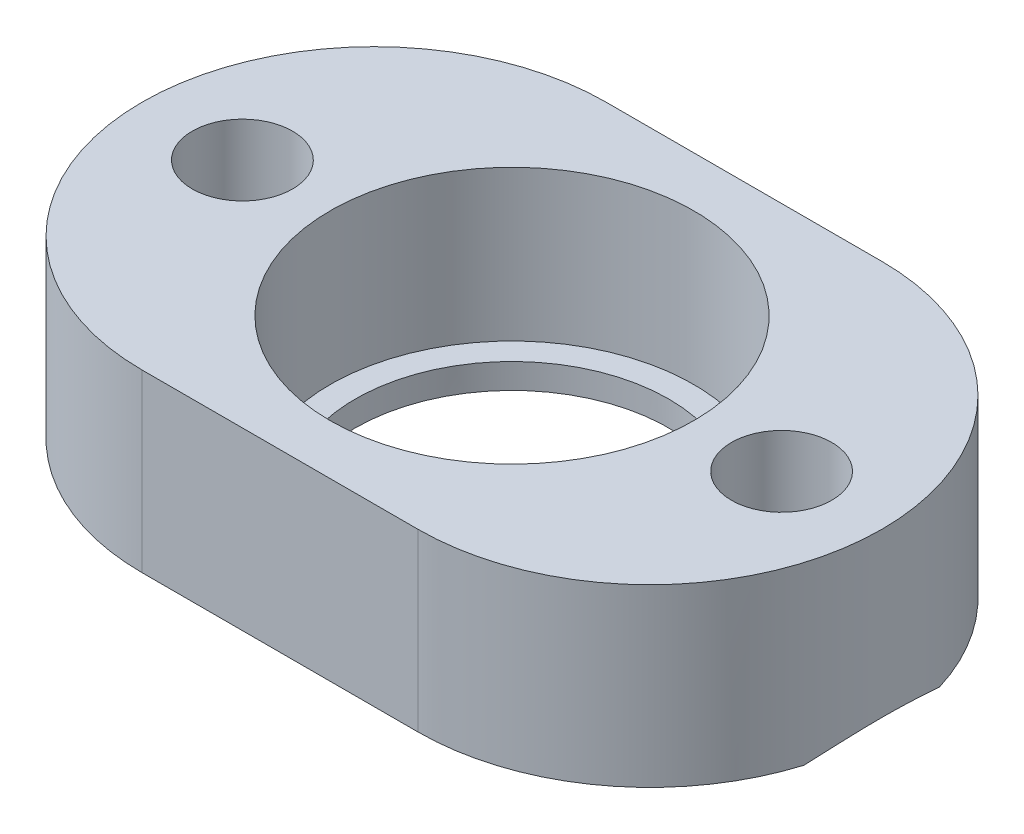
ISO-10303-21;
HEADER;
FILE_DESCRIPTION(('STEP AP214'),'2;1');
FILE_NAME('part.step','',(''),(''),'','','');
FILE_SCHEMA(('AUTOMOTIVE_DESIGN { 1 0 10303 214 1 1 1 1 }'));
ENDSEC;
DATA;
#1=APPLICATION_CONTEXT('core data for automotive mechanical design processes');
#2=APPLICATION_PROTOCOL_DEFINITION('international standard','automotive_design',2000,#1);
#3=PRODUCT_CONTEXT('',#1,'mechanical');
#4=PRODUCT('Part','Part','',(#3));
#5=PRODUCT_RELATED_PRODUCT_CATEGORY('part','',(#4));
#6=PRODUCT_DEFINITION_FORMATION('','',#4);
#7=PRODUCT_DEFINITION_CONTEXT('part definition',#1,'design');
#8=PRODUCT_DEFINITION('design','',#6,#7);
#9=PRODUCT_DEFINITION_SHAPE('','',#8);
#10=(LENGTH_UNIT() NAMED_UNIT(*) SI_UNIT(.MILLI.,.METRE.));
#11=(NAMED_UNIT(*) PLANE_ANGLE_UNIT() SI_UNIT($,.RADIAN.));
#12=(NAMED_UNIT(*) SI_UNIT($,.STERADIAN.) SOLID_ANGLE_UNIT());
#13=UNCERTAINTY_MEASURE_WITH_UNIT(LENGTH_MEASURE(1.E-05),#10,'distance_accuracy_value','');
#14=(GEOMETRIC_REPRESENTATION_CONTEXT(3) GLOBAL_UNCERTAINTY_ASSIGNED_CONTEXT((#13)) GLOBAL_UNIT_ASSIGNED_CONTEXT((#10,
#11,#12)) REPRESENTATION_CONTEXT('',''));
#15=CARTESIAN_POINT('',(0.,0.,0.));
#16=DIRECTION('',(0.,0.,1.));
#17=DIRECTION('',(1.,0.,0.));
#18=AXIS2_PLACEMENT_3D('',#15,#16,#17);
#19=CARTESIAN_POINT('',(0.,-1.,0.));
#20=DIRECTION('',(0.,1.,0.));
#21=DIRECTION('',(0.,0.,1.));
#22=AXIS2_PLACEMENT_3D('',#19,#20,#21);
#23=PLANE('',#22);
#24=CARTESIAN_POINT('',(5.5,-1.,0.));
#25=DIRECTION('',(0.,1.,0.));
#26=DIRECTION('',(0.,0.,1.));
#27=AXIS2_PLACEMENT_3D('',#24,#25,#26);
#28=CIRCLE('',#27,9.25);
#29=CARTESIAN_POINT('',(14.3452380952381,-1.,-2.70633756921577));
#30=VERTEX_POINT('',#29);
#31=CARTESIAN_POINT('',(5.5,-1.,-9.25));
#32=VERTEX_POINT('',#31);
#33=EDGE_CURVE('E125',#30,#32,#28,.T.);
#34=ORIENTED_EDGE('',*,*,#33,.F.);
#35=CARTESIAN_POINT('',(10.75,-1.,0.));
#36=DIRECTION('',(0.,1.,0.));
#37=DIRECTION('',(0.,0.,1.));
#38=AXIS2_PLACEMENT_3D('',#35,#36,#37);
#39=CIRCLE('',#38,4.5);
#40=CARTESIAN_POINT('',(6.25,-1.,0.));
#41=VERTEX_POINT('',#40);
#42=EDGE_CURVE('E195',#30,#41,#39,.T.);
#43=ORIENTED_EDGE('',*,*,#42,.T.);
#44=CARTESIAN_POINT('',(0.,-1.,0.));
#45=DIRECTION('',(0.,1.,0.));
#46=DIRECTION('',(0.,0.,1.));
#47=AXIS2_PLACEMENT_3D('',#44,#45,#46);
#48=CIRCLE('',#47,6.25);
#49=CARTESIAN_POINT('',(-6.25,-1.,0.));
#50=VERTEX_POINT('',#49);
#51=EDGE_CURVE('E148',#41,#50,#48,.T.);
#52=ORIENTED_EDGE('',*,*,#51,.T.);
#53=CARTESIAN_POINT('',(-10.75,-1.,0.));
#54=DIRECTION('',(0.,1.,0.));
#55=DIRECTION('',(0.,0.,1.));
#56=AXIS2_PLACEMENT_3D('',#53,#54,#55);
#57=CIRCLE('',#56,4.5);
#58=CARTESIAN_POINT('',(-14.3452380952381,-1.,-2.70633756921577));
#59=VERTEX_POINT('',#58);
#60=EDGE_CURVE('E58',#50,#59,#57,.T.);
#61=ORIENTED_EDGE('',*,*,#60,.T.);
#62=CARTESIAN_POINT('',(-5.5,-1.,0.));
#63=DIRECTION('',(0.,1.,0.));
#64=DIRECTION('',(0.,0.,1.));
#65=AXIS2_PLACEMENT_3D('',#62,#63,#64);
#66=CIRCLE('',#65,9.25);
#67=CARTESIAN_POINT('',(-5.5,-1.,-9.25));
#68=VERTEX_POINT('',#67);
#69=EDGE_CURVE('E143',#68,#59,#66,.T.);
#70=ORIENTED_EDGE('',*,*,#69,.F.);
#71=DIRECTION('',(1.,0.,0.));
#72=VECTOR('',#71,1.);
#73=CARTESIAN_POINT('',(0.,-1.,-9.25));
#74=LINE('',#73,#72);
#75=EDGE_CURVE('E124',#68,#32,#74,.T.);
#76=ORIENTED_EDGE('',*,*,#75,.T.);
#77=EDGE_LOOP('',(#34,#43,#52,#61,#70,#76));
#78=FACE_BOUND('',#77,.T.);
#79=ADVANCED_FACE('F41',(#78),#23,.F.);
#80=CARTESIAN_POINT('',(0.,6.,9.25));
#81=DIRECTION('',(0.,0.,-1.));
#82=DIRECTION('',(-1.,0.,0.));
#83=AXIS2_PLACEMENT_3D('',#80,#81,#82);
#84=PLANE('',#83);
#85=DIRECTION('',(0.,-1.,0.));
#86=VECTOR('',#85,1.);
#87=CARTESIAN_POINT('',(-5.5,6.,9.25));
#88=LINE('',#87,#86);
#89=CARTESIAN_POINT('',(-5.5,6.,9.25));
#90=VERTEX_POINT('',#89);
#91=CARTESIAN_POINT('',(-5.5,-1.,9.25));
#92=VERTEX_POINT('',#91);
#93=EDGE_CURVE('E130',#90,#92,#88,.T.);
#94=ORIENTED_EDGE('',*,*,#93,.T.);
#95=DIRECTION('',(1.,0.,0.));
#96=VECTOR('',#95,1.);
#97=CARTESIAN_POINT('',(0.,-1.,9.25));
#98=LINE('',#97,#96);
#99=CARTESIAN_POINT('',(5.5,-1.,9.25));
#100=VERTEX_POINT('',#99);
#101=EDGE_CURVE('E122',#92,#100,#98,.T.);
#102=ORIENTED_EDGE('',*,*,#101,.T.);
#103=DIRECTION('',(0.,-1.,0.));
#104=VECTOR('',#103,1.);
#105=CARTESIAN_POINT('',(5.5,6.,9.25));
#106=LINE('',#105,#104);
#107=CARTESIAN_POINT('',(5.5,6.,9.25));
#108=VERTEX_POINT('',#107);
#109=EDGE_CURVE('E104',#108,#100,#106,.T.);
#110=ORIENTED_EDGE('',*,*,#109,.F.);
#111=DIRECTION('',(1.,0.,0.));
#112=VECTOR('',#111,1.);
#113=CARTESIAN_POINT('',(0.,6.,9.25));
#114=LINE('',#113,#112);
#115=EDGE_CURVE('E165',#90,#108,#114,.T.);
#116=ORIENTED_EDGE('',*,*,#115,.F.);
#117=EDGE_LOOP('',(#94,#102,#110,#116));
#118=FACE_BOUND('',#117,.T.);
#119=ADVANCED_FACE('F128',(#118),#84,.F.);
#120=CARTESIAN_POINT('',(5.5,6.,0.));
#121=DIRECTION('',(0.,-1.,0.));
#122=DIRECTION('',(0.,0.,-1.));
#123=AXIS2_PLACEMENT_3D('',#120,#121,#122);
#124=CYLINDRICAL_SURFACE('',#123,9.25);
#125=CARTESIAN_POINT('',(14.3452380952381,-1.,2.70633756921577));
#126=VERTEX_POINT('',#125);
#127=EDGE_CURVE('E107',#100,#126,#28,.T.);
#128=ORIENTED_EDGE('',*,*,#127,.T.);
#129=CARTESIAN_POINT('',(14.3452380952381,-1.,2.70633756921577));
#130=CARTESIAN_POINT('',(14.4005407688638,-0.935493695261102,2.52564014494542));
#131=CARTESIAN_POINT('',(14.4507745591444,-0.875482764336143,2.34161394553068));
#132=CARTESIAN_POINT('',(14.5404234067328,-0.766556499262465,1.96730652761882));
#133=CARTESIAN_POINT('',(14.5798149102748,-0.717665361102824,1.7770126811542));
#134=CARTESIAN_POINT('',(14.6466442212189,-0.633643403359603,1.39255970363823));
#135=CARTESIAN_POINT('',(14.6741549685721,-0.598428757669724,1.19843203770935));
#136=CARTESIAN_POINT('',(14.7168490347795,-0.543371774768669,0.806804065461048));
#137=CARTESIAN_POINT('',(14.7320433796191,-0.523515688878993,0.609306937693022));
#138=CARTESIAN_POINT('',(14.7490684829981,-0.501236745924466,0.226572270761467));
#139=CARTESIAN_POINT('',(14.7517555904864,-0.497696921483751,0.0414379650190529));
#140=CARTESIAN_POINT('',(14.7460185790206,-0.505223947814993,-0.328406211838497));
#141=CARTESIAN_POINT('',(14.7375916413979,-0.516294503972902,-0.513115963378348));
#142=CARTESIAN_POINT('',(14.7098638614297,-0.552375426620868,-0.880220129047334));
#143=CARTESIAN_POINT('',(14.6905684649902,-0.577378811660519,-1.06261565600821));
#144=CARTESIAN_POINT('',(14.6415905753966,-0.639960183183422,-1.42373607203203));
#145=CARTESIAN_POINT('',(14.6119108165069,-0.677534859457195,-1.60246191424279));
#146=CARTESIAN_POINT('',(14.5462218507953,-0.759243839245206,-1.93767050983732));
#147=CARTESIAN_POINT('',(14.511140516177,-0.802348579223171,-2.09459236902607));
#148=CARTESIAN_POINT('',(14.4336047983298,-0.895947133983661,-2.40386466733927));
#149=CARTESIAN_POINT('',(14.3911712527582,-0.946420003990821,-2.55622663619054));
#150=CARTESIAN_POINT('',(14.3452380952381,-1.,-2.70633756921577));
#151=B_SPLINE_CURVE_WITH_KNOTS('',3,(#129,#130,#131,#132,#133,#134,#135,#136,#137,#138,#139,
#140,#141,#142,#143,#144,#145,#146,#147,#148,#149,#150),.UNSPECIFIED.,.F.,.F.,(4,2,2,2,2,2,2,2,
2,2,4),(0.,0.599126952346497,1.19954535495381,1.79622329114623,2.39236647291312,
2.94702618814857,3.5018265994667,4.05634926151056,4.61072602418988,5.10974967093786,
5.60738145213413),.UNSPECIFIED.);
#152=EDGE_CURVE('E198',#126,#30,#151,.T.);
#153=ORIENTED_EDGE('',*,*,#152,.T.);
#154=ORIENTED_EDGE('',*,*,#33,.T.);
#155=DIRECTION('',(0.,-1.,0.));
#156=VECTOR('',#155,1.);
#157=CARTESIAN_POINT('',(5.5,6.,-9.25));
#158=LINE('',#157,#156);
#159=CARTESIAN_POINT('',(5.5,6.,-9.25));
#160=VERTEX_POINT('',#159);
#161=EDGE_CURVE('E115',#160,#32,#158,.T.);
#162=ORIENTED_EDGE('',*,*,#161,.F.);
#163=CARTESIAN_POINT('',(5.5,6.,0.));
#164=DIRECTION('',(0.,1.,0.));
#165=DIRECTION('',(0.,0.,1.));
#166=AXIS2_PLACEMENT_3D('',#163,#164,#165);
#167=CIRCLE('',#166,9.25);
#168=EDGE_CURVE('E109',#108,#160,#167,.T.);
#169=ORIENTED_EDGE('',*,*,#168,.F.);
#170=ORIENTED_EDGE('',*,*,#109,.T.);
#171=EDGE_LOOP('',(#128,#153,#154,#162,#169,#170));
#172=FACE_BOUND('',#171,.T.);
#173=ADVANCED_FACE('F106',(#172),#124,.T.);
#174=CARTESIAN_POINT('',(0.,6.,-9.25));
#175=DIRECTION('',(0.,0.,-1.));
#176=DIRECTION('',(-1.,0.,0.));
#177=AXIS2_PLACEMENT_3D('',#174,#175,#176);
#178=PLANE('',#177);
#179=ORIENTED_EDGE('',*,*,#161,.T.);
#180=ORIENTED_EDGE('',*,*,#75,.F.);
#181=DIRECTION('',(0.,-1.,0.));
#182=VECTOR('',#181,1.);
#183=CARTESIAN_POINT('',(-5.5,6.,-9.25));
#184=LINE('',#183,#182);
#185=CARTESIAN_POINT('',(-5.5,6.,-9.25));
#186=VERTEX_POINT('',#185);
#187=EDGE_CURVE('E182',#186,#68,#184,.T.);
#188=ORIENTED_EDGE('',*,*,#187,.F.);
#189=DIRECTION('',(1.,0.,0.));
#190=VECTOR('',#189,1.);
#191=CARTESIAN_POINT('',(0.,6.,-9.25));
#192=LINE('',#191,#190);
#193=EDGE_CURVE('E170',#186,#160,#192,.T.);
#194=ORIENTED_EDGE('',*,*,#193,.T.);
#195=EDGE_LOOP('',(#179,#180,#188,#194));
#196=FACE_BOUND('',#195,.T.);
#197=ADVANCED_FACE('F214',(#196),#178,.T.);
#198=CARTESIAN_POINT('',(-10.75,6.,0.));
#199=DIRECTION('',(0.,-1.,0.));
#200=DIRECTION('',(0.,0.,-1.));
#201=AXIS2_PLACEMENT_3D('',#198,#199,#200);
#202=CYLINDRICAL_SURFACE('',#201,2.);
#203=CARTESIAN_POINT('',(-10.75,1.50000000000001,0.));
#204=DIRECTION('',(0.,1.,0.));
#205=DIRECTION('',(0.,0.,1.));
#206=AXIS2_PLACEMENT_3D('',#203,#204,#205);
#207=CIRCLE('',#206,2.);
#208=CARTESIAN_POINT('',(-10.75,1.50000000000001,2.));
#209=VERTEX_POINT('',#208);
#210=EDGE_CURVE('E11',#209,#209,#207,.F.);
#211=ORIENTED_EDGE('',*,*,#210,.T.);
#212=EDGE_LOOP('',(#211));
#213=FACE_BOUND('',#212,.T.);
#214=CARTESIAN_POINT('',(-10.75,6.,0.));
#215=DIRECTION('',(0.,1.,0.));
#216=DIRECTION('',(0.,0.,1.));
#217=AXIS2_PLACEMENT_3D('',#214,#215,#216);
#218=CIRCLE('',#217,2.);
#219=CARTESIAN_POINT('',(-10.75,6.,2.));
#220=VERTEX_POINT('',#219);
#221=EDGE_CURVE('E161',#220,#220,#218,.T.);
#222=ORIENTED_EDGE('',*,*,#221,.T.);
#223=EDGE_LOOP('',(#222));
#224=FACE_BOUND('',#223,.T.);
#225=ADVANCED_FACE('F218',(#213,#224),#202,.F.);
#226=CARTESIAN_POINT('',(0.,6.,0.));
#227=DIRECTION('',(0.,-1.,0.));
#228=DIRECTION('',(0.,0.,-1.));
#229=AXIS2_PLACEMENT_3D('',#226,#227,#228);
#230=CYLINDRICAL_SURFACE('',#229,7.25);
#231=CARTESIAN_POINT('',(0.,6.,0.));
#232=DIRECTION('',(0.,1.,0.));
#233=DIRECTION('',(0.,0.,1.));
#234=AXIS2_PLACEMENT_3D('',#231,#232,#233);
#235=CIRCLE('',#234,7.25);
#236=CARTESIAN_POINT('',(0.,6.,7.25));
#237=VERTEX_POINT('',#236);
#238=EDGE_CURVE('E157',#237,#237,#235,.T.);
#239=ORIENTED_EDGE('',*,*,#238,.T.);
#240=EDGE_LOOP('',(#239));
#241=FACE_BOUND('',#240,.T.);
#242=CARTESIAN_POINT('',(0.,0.,0.));
#243=DIRECTION('',(0.,1.,0.));
#244=DIRECTION('',(0.,0.,1.));
#245=AXIS2_PLACEMENT_3D('',#242,#243,#244);
#246=CIRCLE('',#245,7.25);
#247=CARTESIAN_POINT('',(0.,0.,7.25));
#248=VERTEX_POINT('',#247);
#249=EDGE_CURVE('E151',#248,#248,#246,.T.);
#250=ORIENTED_EDGE('',*,*,#249,.F.);
#251=EDGE_LOOP('',(#250));
#252=FACE_BOUND('',#251,.T.);
#253=ADVANCED_FACE('F221',(#241,#252),#230,.F.);
#254=CARTESIAN_POINT('',(10.75,6.,0.));
#255=DIRECTION('',(0.,-1.,0.));
#256=DIRECTION('',(0.,0.,-1.));
#257=AXIS2_PLACEMENT_3D('',#254,#255,#256);
#258=CYLINDRICAL_SURFACE('',#257,2.);
#259=CARTESIAN_POINT('',(10.75,1.50000000000001,0.));
#260=DIRECTION('',(0.,1.,0.));
#261=DIRECTION('',(0.,0.,1.));
#262=AXIS2_PLACEMENT_3D('',#259,#260,#261);
#263=CIRCLE('',#262,2.);
#264=CARTESIAN_POINT('',(10.75,1.50000000000001,2.));
#265=VERTEX_POINT('',#264);
#266=EDGE_CURVE('E206',#265,#265,#263,.F.);
#267=ORIENTED_EDGE('',*,*,#266,.T.);
#268=EDGE_LOOP('',(#267));
#269=FACE_BOUND('',#268,.T.);
#270=CARTESIAN_POINT('',(10.75,6.,0.));
#271=DIRECTION('',(0.,1.,0.));
#272=DIRECTION('',(0.,0.,1.));
#273=AXIS2_PLACEMENT_3D('',#270,#271,#272);
#274=CIRCLE('',#273,2.);
#275=CARTESIAN_POINT('',(10.75,6.,2.));
#276=VERTEX_POINT('',#275);
#277=EDGE_CURVE('E153',#276,#276,#274,.T.);
#278=ORIENTED_EDGE('',*,*,#277,.T.);
#279=EDGE_LOOP('',(#278));
#280=FACE_BOUND('',#279,.T.);
#281=ADVANCED_FACE('F224',(#269,#280),#258,.F.);
#282=CARTESIAN_POINT('',(-5.5,6.,0.));
#283=DIRECTION('',(0.,-1.,0.));
#284=DIRECTION('',(0.,0.,-1.));
#285=AXIS2_PLACEMENT_3D('',#282,#283,#284);
#286=CYLINDRICAL_SURFACE('',#285,9.25);
#287=ORIENTED_EDGE('',*,*,#69,.T.);
#288=CARTESIAN_POINT('',(-14.3452380952381,-1.,-2.70633756921577));
#289=CARTESIAN_POINT('',(-14.4005407688638,-0.935493695261102,-2.52564014494542));
#290=CARTESIAN_POINT('',(-14.4507745591444,-0.875482764336143,-2.34161394553068));
#291=CARTESIAN_POINT('',(-14.5404234067328,-0.766556499262465,-1.96730652761882));
#292=CARTESIAN_POINT('',(-14.5798149102748,-0.717665361102824,-1.7770126811542));
#293=CARTESIAN_POINT('',(-14.6466442212189,-0.633643403359603,-1.39255970363823));
#294=CARTESIAN_POINT('',(-14.6741549685721,-0.598428757669724,-1.19843203770935));
#295=CARTESIAN_POINT('',(-14.7168490347795,-0.543371774768669,-0.806804065461048));
#296=CARTESIAN_POINT('',(-14.7320433796191,-0.523515688878993,-0.609306937693022));
#297=CARTESIAN_POINT('',(-14.7490684829981,-0.501236745924466,-0.226572270761467));
#298=CARTESIAN_POINT('',(-14.7517555904864,-0.497696921483751,-0.0414379650190529));
#299=CARTESIAN_POINT('',(-14.7460185790206,-0.505223947814993,0.328406211838497));
#300=CARTESIAN_POINT('',(-14.7375916413979,-0.516294503972902,0.513115963378348));
#301=CARTESIAN_POINT('',(-14.7098638614297,-0.552375426620868,0.880220129047334));
#302=CARTESIAN_POINT('',(-14.6905684649902,-0.577378811660519,1.06261565600821));
#303=CARTESIAN_POINT('',(-14.6415905753966,-0.639960183183422,1.42373607203203));
#304=CARTESIAN_POINT('',(-14.6119108165069,-0.677534859457195,1.60246191424279));
#305=CARTESIAN_POINT('',(-14.5462218507953,-0.759243839245206,1.93767050983732));
#306=CARTESIAN_POINT('',(-14.511140516177,-0.802348579223171,2.09459236902607));
#307=CARTESIAN_POINT('',(-14.4336047983298,-0.895947133983661,2.40386466733927));
#308=CARTESIAN_POINT('',(-14.3911712527582,-0.946420003990821,2.55622663619054));
#309=CARTESIAN_POINT('',(-14.3452380952381,-1.,2.70633756921577));
#310=B_SPLINE_CURVE_WITH_KNOTS('',3,(#288,#289,#290,#291,#292,#293,#294,#295,#296,#297,#298,
#299,#300,#301,#302,#303,#304,#305,#306,#307,#308,#309),.UNSPECIFIED.,.F.,.F.,(4,2,2,2,2,2,2,2,
2,2,4),(0.,0.599126952346497,1.19954535495381,1.79622329114623,2.39236647291312,
2.94702618814857,3.5018265994667,4.05634926151056,4.61072602418988,5.10974967093786,
5.60738145213413),.UNSPECIFIED.);
#311=CARTESIAN_POINT('',(-14.3452380952381,-1.,2.70633756921577));
#312=VERTEX_POINT('',#311);
#313=EDGE_CURVE('E51',#59,#312,#310,.T.);
#314=ORIENTED_EDGE('',*,*,#313,.T.);
#315=EDGE_CURVE('E142',#312,#92,#66,.T.);
#316=ORIENTED_EDGE('',*,*,#315,.T.);
#317=ORIENTED_EDGE('',*,*,#93,.F.);
#318=CARTESIAN_POINT('',(-5.5,6.,0.));
#319=DIRECTION('',(0.,1.,0.));
#320=DIRECTION('',(0.,0.,1.));
#321=AXIS2_PLACEMENT_3D('',#318,#319,#320);
#322=CIRCLE('',#321,9.25);
#323=EDGE_CURVE('E174',#186,#90,#322,.T.);
#324=ORIENTED_EDGE('',*,*,#323,.F.);
#325=ORIENTED_EDGE('',*,*,#187,.T.);
#326=EDGE_LOOP('',(#287,#314,#316,#317,#324,#325));
#327=FACE_BOUND('',#326,.T.);
#328=ADVANCED_FACE('F227',(#327),#286,.T.);
#329=CARTESIAN_POINT('',(0.,6.,0.));
#330=DIRECTION('',(0.,1.,0.));
#331=DIRECTION('',(0.,0.,1.));
#332=AXIS2_PLACEMENT_3D('',#329,#330,#331);
#333=PLANE('',#332);
#334=ORIENTED_EDGE('',*,*,#277,.F.);
#335=EDGE_LOOP('',(#334));
#336=FACE_BOUND('',#335,.T.);
#337=ORIENTED_EDGE('',*,*,#238,.F.);
#338=EDGE_LOOP('',(#337));
#339=FACE_BOUND('',#338,.T.);
#340=ORIENTED_EDGE('',*,*,#221,.F.);
#341=EDGE_LOOP('',(#340));
#342=FACE_BOUND('',#341,.T.);
#343=ORIENTED_EDGE('',*,*,#115,.T.);
#344=ORIENTED_EDGE('',*,*,#168,.T.);
#345=ORIENTED_EDGE('',*,*,#193,.F.);
#346=ORIENTED_EDGE('',*,*,#323,.T.);
#347=EDGE_LOOP('',(#343,#344,#345,#346));
#348=FACE_BOUND('',#347,.T.);
#349=ADVANCED_FACE('F232',(#336,#339,#342,#348),#333,.T.);
#350=CARTESIAN_POINT('',(0.,0.,0.));
#351=DIRECTION('',(0.,1.,0.));
#352=DIRECTION('',(0.,0.,1.));
#353=AXIS2_PLACEMENT_3D('',#350,#351,#352);
#354=PLANE('',#353);
#355=CARTESIAN_POINT('',(0.,0.,0.));
#356=DIRECTION('',(0.,1.,0.));
#357=DIRECTION('',(0.,0.,1.));
#358=AXIS2_PLACEMENT_3D('',#355,#356,#357);
#359=CIRCLE('',#358,6.25);
#360=CARTESIAN_POINT('',(0.,0.,6.25));
#361=VERTEX_POINT('',#360);
#362=EDGE_CURVE('E132',#361,#361,#359,.T.);
#363=ORIENTED_EDGE('',*,*,#362,.F.);
#364=EDGE_LOOP('',(#363));
#365=FACE_BOUND('',#364,.T.);
#366=ORIENTED_EDGE('',*,*,#249,.T.);
#367=EDGE_LOOP('',(#366));
#368=FACE_BOUND('',#367,.T.);
#369=ADVANCED_FACE('F250',(#365,#368),#354,.T.);
#370=CARTESIAN_POINT('',(0.,-1.,0.));
#371=DIRECTION('',(0.,1.,0.));
#372=DIRECTION('',(0.,0.,1.));
#373=AXIS2_PLACEMENT_3D('',#370,#371,#372);
#374=CYLINDRICAL_SURFACE('',#373,6.25);
#375=ORIENTED_EDGE('',*,*,#51,.F.);
#376=EDGE_CURVE('E147',#50,#41,#48,.T.);
#377=ORIENTED_EDGE('',*,*,#376,.F.);
#378=EDGE_LOOP('',(#375,#377));
#379=FACE_BOUND('',#378,.T.);
#380=ORIENTED_EDGE('',*,*,#362,.T.);
#381=EDGE_LOOP('',(#380));
#382=FACE_BOUND('',#381,.T.);
#383=ADVANCED_FACE('F244',(#379,#382),#374,.F.);
#384=ORIENTED_EDGE('',*,*,#376,.T.);
#385=CARTESIAN_POINT('',(10.75,-1.,0.));
#386=DIRECTION('',(0.,1.,0.));
#387=DIRECTION('',(0.,0.,1.));
#388=AXIS2_PLACEMENT_3D('',#385,#386,#387);
#389=CIRCLE('',#388,4.5);
#390=EDGE_CURVE('E66',#41,#126,#389,.T.);
#391=ORIENTED_EDGE('',*,*,#390,.T.);
#392=ORIENTED_EDGE('',*,*,#127,.F.);
#393=ORIENTED_EDGE('',*,*,#101,.F.);
#394=ORIENTED_EDGE('',*,*,#315,.F.);
#395=CARTESIAN_POINT('',(-10.75,-1.,0.));
#396=DIRECTION('',(0.,1.,0.));
#397=DIRECTION('',(0.,0.,1.));
#398=AXIS2_PLACEMENT_3D('',#395,#396,#397);
#399=CIRCLE('',#398,4.5);
#400=EDGE_CURVE('E190',#312,#50,#399,.T.);
#401=ORIENTED_EDGE('',*,*,#400,.T.);
#402=EDGE_LOOP('',(#384,#391,#392,#393,#394,#401));
#403=FACE_BOUND('',#402,.T.);
#404=ADVANCED_FACE('F120',(#403),#23,.F.);
#405=CARTESIAN_POINT('',(10.75,-1.,0.));
#406=DIRECTION('',(0.,-1.,0.));
#407=DIRECTION('',(0.,0.,-1.));
#408=AXIS2_PLACEMENT_3D('',#405,#406,#407);
#409=CONICAL_SURFACE('',#408,4.5,0.785398163397446);
#410=ORIENTED_EDGE('',*,*,#266,.F.);
#411=EDGE_LOOP('',(#410));
#412=FACE_BOUND('',#411,.T.);
#413=ORIENTED_EDGE('',*,*,#390,.F.);
#414=ORIENTED_EDGE('',*,*,#42,.F.);
#415=ORIENTED_EDGE('',*,*,#152,.F.);
#416=EDGE_LOOP('',(#413,#414,#415));
#417=FACE_BOUND('',#416,.T.);
#418=ADVANCED_FACE('F207',(#412,#417),#409,.F.);
#419=CARTESIAN_POINT('',(-10.75,-1.,0.));
#420=DIRECTION('',(0.,-1.,0.));
#421=DIRECTION('',(0.,0.,-1.));
#422=AXIS2_PLACEMENT_3D('',#419,#420,#421);
#423=CONICAL_SURFACE('',#422,4.5,0.785398163397446);
#424=ORIENTED_EDGE('',*,*,#210,.F.);
#425=EDGE_LOOP('',(#424));
#426=FACE_BOUND('',#425,.T.);
#427=ORIENTED_EDGE('',*,*,#60,.F.);
#428=ORIENTED_EDGE('',*,*,#400,.F.);
#429=ORIENTED_EDGE('',*,*,#313,.F.);
#430=EDGE_LOOP('',(#427,#428,#429));
#431=FACE_BOUND('',#430,.T.);
#432=ADVANCED_FACE('F43',(#426,#431),#423,.F.);
#433=CLOSED_SHELL('',(#79,#119,#173,#197,#225,#253,#281,#328,#349,#369,#383,#404,#418,#432));
#434=MANIFOLD_SOLID_BREP('B2',#433);
#435=ADVANCED_BREP_SHAPE_REPRESENTATION('',(#18,#434),#14);
#436=SHAPE_DEFINITION_REPRESENTATION(#9,#435);
ENDSEC;
END-ISO-10303-21;
